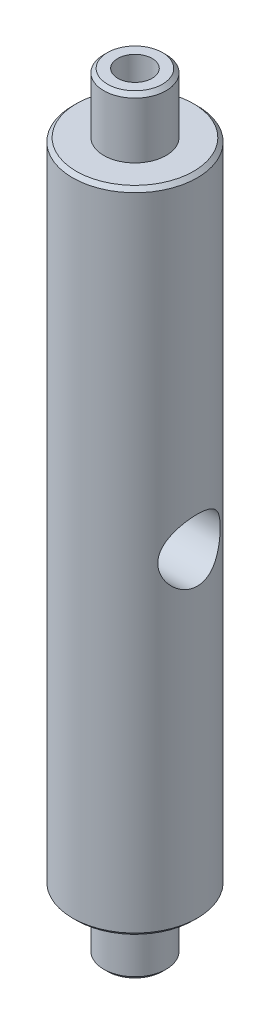
ISO-10303-21;
HEADER;
FILE_DESCRIPTION(('STEP AP214'),'2;1');
FILE_NAME('part.step','',(''),(''),'','','');
FILE_SCHEMA(('AUTOMOTIVE_DESIGN { 1 0 10303 214 1 1 1 1 }'));
ENDSEC;
DATA;
#1=APPLICATION_CONTEXT('core data for automotive mechanical design processes');
#2=APPLICATION_PROTOCOL_DEFINITION('international standard','automotive_design',2000,#1);
#3=PRODUCT_CONTEXT('',#1,'mechanical');
#4=PRODUCT('Part','Part','',(#3));
#5=PRODUCT_RELATED_PRODUCT_CATEGORY('part','',(#4));
#6=PRODUCT_DEFINITION_FORMATION('','',#4);
#7=PRODUCT_DEFINITION_CONTEXT('part definition',#1,'design');
#8=PRODUCT_DEFINITION('design','',#6,#7);
#9=PRODUCT_DEFINITION_SHAPE('','',#8);
#10=(LENGTH_UNIT() NAMED_UNIT(*) SI_UNIT(.MILLI.,.METRE.));
#11=(NAMED_UNIT(*) PLANE_ANGLE_UNIT() SI_UNIT($,.RADIAN.));
#12=(NAMED_UNIT(*) SI_UNIT($,.STERADIAN.) SOLID_ANGLE_UNIT());
#13=UNCERTAINTY_MEASURE_WITH_UNIT(LENGTH_MEASURE(1.E-05),#10,'distance_accuracy_value','');
#14=(GEOMETRIC_REPRESENTATION_CONTEXT(3) GLOBAL_UNCERTAINTY_ASSIGNED_CONTEXT((#13)) GLOBAL_UNIT_ASSIGNED_CONTEXT((#10,
#11,#12)) REPRESENTATION_CONTEXT('',''));
#15=CARTESIAN_POINT('',(0.,0.,0.));
#16=DIRECTION('',(0.,0.,1.));
#17=DIRECTION('',(1.,0.,0.));
#18=AXIS2_PLACEMENT_3D('',#15,#16,#17);
#19=CARTESIAN_POINT('',(0.,66.04,0.));
#20=DIRECTION('',(0.,1.,0.));
#21=DIRECTION('',(0.,0.,1.));
#22=AXIS2_PLACEMENT_3D('',#19,#20,#21);
#23=PLANE('',#22);
#24=CARTESIAN_POINT('',(0.,66.04,0.));
#25=DIRECTION('',(0.,1.,0.));
#26=DIRECTION('',(0.,0.,1.));
#27=AXIS2_PLACEMENT_3D('',#24,#25,#26);
#28=CIRCLE('',#27,5.96899999999999);
#29=CARTESIAN_POINT('',(0.,66.04,5.96899999999999));
#30=VERTEX_POINT('',#29);
#31=EDGE_CURVE('E127',#30,#30,#28,.T.);
#32=ORIENTED_EDGE('',*,*,#31,.T.);
#33=EDGE_LOOP('',(#32));
#34=FACE_BOUND('',#33,.T.);
#35=CARTESIAN_POINT('',(0.,66.04,0.));
#36=DIRECTION('',(0.,1.,0.));
#37=DIRECTION('',(0.,0.,1.));
#38=AXIS2_PLACEMENT_3D('',#35,#36,#37);
#39=CIRCLE('',#38,3.175);
#40=CARTESIAN_POINT('',(0.,66.04,-3.175));
#41=VERTEX_POINT('',#40);
#42=EDGE_CURVE('E115',#41,#41,#39,.T.);
#43=ORIENTED_EDGE('',*,*,#42,.F.);
#44=EDGE_LOOP('',(#43));
#45=FACE_BOUND('',#44,.T.);
#46=ADVANCED_FACE('F31',(#34,#45),#23,.T.);
#47=CARTESIAN_POINT('',(0.,0.,0.));
#48=DIRECTION('',(0.,1.,0.));
#49=DIRECTION('',(0.,0.,1.));
#50=AXIS2_PLACEMENT_3D('',#47,#48,#49);
#51=PLANE('',#50);
#52=CARTESIAN_POINT('',(0.,0.,0.));
#53=DIRECTION('',(0.,1.,0.));
#54=DIRECTION('',(0.,0.,1.));
#55=AXIS2_PLACEMENT_3D('',#52,#53,#54);
#56=CIRCLE('',#55,5.96900000000001);
#57=CARTESIAN_POINT('',(0.,0.,5.96900000000001));
#58=VERTEX_POINT('',#57);
#59=EDGE_CURVE('E109',#58,#58,#56,.F.);
#60=ORIENTED_EDGE('',*,*,#59,.T.);
#61=EDGE_LOOP('',(#60));
#62=FACE_BOUND('',#61,.T.);
#63=CARTESIAN_POINT('',(0.,0.,0.));
#64=DIRECTION('',(0.,1.,0.));
#65=DIRECTION('',(0.,0.,1.));
#66=AXIS2_PLACEMENT_3D('',#63,#64,#65);
#67=CIRCLE('',#66,3.175);
#68=CARTESIAN_POINT('',(0.,0.,3.175));
#69=VERTEX_POINT('',#68);
#70=EDGE_CURVE('E112',#69,#69,#67,.F.);
#71=ORIENTED_EDGE('',*,*,#70,.F.);
#72=EDGE_LOOP('',(#71));
#73=FACE_BOUND('',#72,.T.);
#74=ADVANCED_FACE('F99',(#62,#73),#51,.F.);
#75=CARTESIAN_POINT('',(0.,66.04,0.));
#76=DIRECTION('',(0.,-1.,0.));
#77=DIRECTION('',(0.,0.,-1.));
#78=AXIS2_PLACEMENT_3D('',#75,#76,#77);
#79=CYLINDRICAL_SURFACE('',#78,6.35);
#80=CARTESIAN_POINT('',(-6.35,29.6545,0.));
#81=CARTESIAN_POINT('',(-6.34999931166444,29.6545008877176,-0.0834969220595));
#82=CARTESIAN_POINT('',(-6.34834758911701,29.6577998744459,-0.167002655580043));
#83=CARTESIAN_POINT('',(-6.34179105821715,29.6709458745499,-0.333378330258781));
#84=CARTESIAN_POINT('',(-6.33688483467113,29.6807957365258,-0.416247978955772));
#85=CARTESIAN_POINT('',(-6.31742426748325,29.720072065046,-0.66318203064701));
#86=CARTESIAN_POINT('',(-6.29812827299425,29.7592250774014,-0.825450146761554));
#87=CARTESIAN_POINT('',(-6.2489182313574,29.8614907112941,-1.13965128900426));
#88=CARTESIAN_POINT('',(-6.21904547786825,29.9245102192434,-1.29162180811868));
#89=CARTESIAN_POINT('',(-6.15142812041637,30.0722360736289,-1.58264035037879));
#90=CARTESIAN_POINT('',(-6.11368413715877,30.156940710151,-1.72168939123018));
#91=CARTESIAN_POINT('',(-6.03111096182982,30.3514696297342,-1.99234108848171));
#92=CARTESIAN_POINT('',(-5.98599127270818,30.4625035777939,-2.12298433900091));
#93=CARTESIAN_POINT('',(-5.89470535591056,30.7038966835728,-2.36467069069853));
#94=CARTESIAN_POINT('',(-5.84853836069043,30.8342704297664,-2.47569885601321));
#95=CARTESIAN_POINT('',(-5.75623634934464,31.1229209477533,-2.68368848497886));
#96=CARTESIAN_POINT('',(-5.71038146176788,31.2825775313016,-2.77889135161934));
#97=CARTESIAN_POINT('',(-5.64919759286363,31.5340479871744,-2.90019349951534));
#98=CARTESIAN_POINT('',(-5.63006420805933,31.6199000618287,-2.93705266116891));
#99=CARTESIAN_POINT('',(-5.59504604853268,31.7950856137064,-3.00322508739606));
#100=CARTESIAN_POINT('',(-5.57915935583429,31.8844169981805,-3.03254280972159));
#101=CARTESIAN_POINT('',(-5.55212611635049,32.0605105519647,-3.08174263292982));
#102=CARTESIAN_POINT('',(-5.54075429137746,32.1471107940286,-3.10208128111978));
#103=CARTESIAN_POINT('',(-5.52193654886444,32.3220872789944,-3.13545600360765));
#104=CARTESIAN_POINT('',(-5.51448854851135,32.4104625537717,-3.14849595237257));
#105=CARTESIAN_POINT('',(-5.50383875782919,32.5882067388486,-3.1670771305344));
#106=CARTESIAN_POINT('',(-5.50063441026522,32.6775750179874,-3.17262287599649));
#107=CARTESIAN_POINT('',(-5.49859788398609,32.8564807841781,-3.17614778806993));
#108=CARTESIAN_POINT('',(-5.49976528812799,32.9460182542713,-3.17412767659872));
#109=CARTESIAN_POINT('',(-5.50899190362733,33.1922478757244,-3.1581193033026));
#110=CARTESIAN_POINT('',(-5.52160857357707,33.3483417298134,-3.13621253452965));
#111=CARTESIAN_POINT('',(-5.55866493052824,33.6541466413065,-3.07003746372168));
#112=CARTESIAN_POINT('',(-5.58310838358077,33.8038556490228,-3.02576203854504));
#113=CARTESIAN_POINT('',(-5.64157885407237,34.0970442965641,-2.91531509833647));
#114=CARTESIAN_POINT('',(-5.67581583876129,34.2402976099366,-2.84865758129417));
#115=CARTESIAN_POINT('',(-5.75003268807633,34.514266086174,-2.69570761526054));
#116=CARTESIAN_POINT('',(-5.79001512927804,34.6449755796085,-2.60940634674629));
#117=CARTESIAN_POINT('',(-5.87734289018611,34.9076042742503,-2.40685964249565));
#118=CARTESIAN_POINT('',(-5.92497898403936,35.0375753848565,-2.28820488335253));
#119=CARTESIAN_POINT('',(-6.01813700574905,35.2765851428638,-2.03058898448427));
#120=CARTESIAN_POINT('',(-6.06365791538158,35.3856137863587,-1.89161819563546));
#121=CARTESIAN_POINT('',(-6.1500381059768,35.5844019197197,-1.58913989972483));
#122=CARTESIAN_POINT('',(-6.19058274974572,35.6730314855799,-1.42479265164789));
#123=CARTESIAN_POINT('',(-6.25976272299952,35.8206580816353,-1.08098023585583));
#124=CARTESIAN_POINT('',(-6.28840750578946,35.8796786411317,-0.901527205073899));
#125=CARTESIAN_POINT('',(-6.32854759690357,35.961559403399,-0.548533610626835));
#126=CARTESIAN_POINT('',(-6.34126679122995,35.9870096725873,-0.375734359385246));
#127=CARTESIAN_POINT('',(-6.35231817716325,36.0091505222602,-0.0278752299448329));
#128=CARTESIAN_POINT('',(-6.35065718436129,36.0058547271393,0.147183538060018));
#129=CARTESIAN_POINT('',(-6.33384535408399,35.9720937640546,0.480164686080361));
#130=CARTESIAN_POINT('',(-6.31975005060431,35.9437542085251,0.638363620564188));
#131=CARTESIAN_POINT('',(-6.28085393924121,35.8640441217901,0.947441883052999));
#132=CARTESIAN_POINT('',(-6.25605195113515,35.8126710515227,1.09832040207141));
#133=CARTESIAN_POINT('',(-6.19709998236334,35.6870048690622,1.39347133182512));
#134=CARTESIAN_POINT('',(-6.16270299610718,35.6120984158888,1.53743151047822));
#135=CARTESIAN_POINT('',(-6.08787118465664,35.4421835743141,1.8112148234104));
#136=CARTESIAN_POINT('',(-6.0474337895468,35.3471666226146,1.94103189959927));
#137=CARTESIAN_POINT('',(-5.95973602709939,35.1289606496262,2.19636241342679));
#138=CARTESIAN_POINT('',(-5.91219559251098,35.0039213928884,2.3202013468198));
#139=CARTESIAN_POINT('',(-5.81858093231368,34.7347376448502,2.54589381918873));
#140=CARTESIAN_POINT('',(-5.77250773963547,34.5905800476191,2.6477321493525));
#141=CARTESIAN_POINT('',(-5.68487535288742,34.2784313980416,2.83117262876716));
#142=CARTESIAN_POINT('',(-5.64364281441821,34.1096242304896,2.91155594998014));
#143=CARTESIAN_POINT('',(-5.5744767953732,33.7581555351103,3.04191297152939));
#144=CARTESIAN_POINT('',(-5.54652618900869,33.5755122021526,3.0919258549222));
#145=CARTESIAN_POINT('',(-5.51057765714603,33.2203100435298,3.15551086037918));
#146=CARTESIAN_POINT('',(-5.50092192343245,33.0484662495928,3.17212027309711));
#147=CARTESIAN_POINT('',(-5.49800001145358,32.7042555575048,3.17718805563876));
#148=CARTESIAN_POINT('',(-5.50472672904441,32.5318889184574,3.16565862768386));
#149=CARTESIAN_POINT('',(-5.53205211477784,32.2088398969261,3.11761548073658));
#150=CARTESIAN_POINT('',(-5.55126823076269,32.0576560582688,3.08358651207686));
#151=CARTESIAN_POINT('',(-5.59977978302582,31.7633091698328,2.99458164828807));
#152=CARTESIAN_POINT('',(-5.62907846127335,31.6201487171497,2.93959901505999));
#153=CARTESIAN_POINT('',(-5.69685576337174,31.3352663005715,2.8061154442137));
#154=CARTESIAN_POINT('',(-5.73581889480533,31.1942871906343,2.72628260503929));
#155=CARTESIAN_POINT('',(-5.81772207082382,30.9268025682769,2.54682759156583));
#156=CARTESIAN_POINT('',(-5.8606641782013,30.8003046400573,2.44719512169931));
#157=CARTESIAN_POINT('',(-5.95192753761203,30.5494024758229,2.21680287661219));
#158=CARTESIAN_POINT('',(-6.00026839877346,30.4271202435872,2.08373188558712));
#159=CARTESIAN_POINT('',(-6.0921234557675,30.2061021267669,1.79751265125244));
#160=CARTESIAN_POINT('',(-6.13563504323043,30.1073789340173,1.64435365457428));
#161=CARTESIAN_POINT('',(-6.19391073190243,29.9792197338029,1.40178715704487));
#162=CARTESIAN_POINT('',(-6.21223173271383,29.9396994163186,1.31842200030918));
#163=CARTESIAN_POINT('',(-6.24595363475604,29.8679005251763,1.1480770102167));
#164=CARTESIAN_POINT('',(-6.26135597012704,29.8356183934656,1.06109897786306));
#165=CARTESIAN_POINT('',(-6.28875097111981,29.778740654085,0.884361322813107));
#166=CARTESIAN_POINT('',(-6.30075106809478,29.7541282818619,0.794608244970571));
#167=CARTESIAN_POINT('',(-6.32100983571903,29.7128326104701,0.612925661591581));
#168=CARTESIAN_POINT('',(-6.3292707916836,29.6961444678064,0.52099752168029));
#169=CARTESIAN_POINT('',(-6.34032503263334,29.6738837151376,0.357531347524375));
#170=CARTESIAN_POINT('',(-6.34394670812889,29.6666211787504,0.286274046488597));
#171=CARTESIAN_POINT('',(-6.34878452045567,29.6569288734624,0.143346668941348));
#172=CARTESIAN_POINT('',(-6.35000059089052,29.6544992379532,0.0716765810914262));
#173=CARTESIAN_POINT('',(-6.35,29.6545,0.));
#174=B_SPLINE_CURVE_WITH_KNOTS('',3,(#80,#81,#82,#83,#84,#85,#86,#87,#88,#89,#90,#91,#92,#93,
#94,#95,#96,#97,#98,#99,#100,#101,#102,#103,#104,#105,#106,#107,#108,#109,#110,#111,#112,#113,
#114,#115,#116,#117,#118,#119,#120,#121,#122,#123,#124,#125,#126,#127,#128,#129,#130,#131,#132,
#133,#134,#135,#136,#137,#138,#139,#140,#141,#142,#143,#144,#145,#146,#147,#148,#149,#150,#151,
#152,#153,#154,#155,#156,#157,#158,#159,#160,#161,#162,#163,#164,#165,#166,#167,#168,#169,#170,
#171,#172,#173),.UNSPECIFIED.,.T.,.F.,(4,2,2,2,2,2,2,2,2,2,2,2,2,2,2,2,2,2,2,2,2,2,2,2,2,2,2,2,
2,2,2,2,2,2,2,2,2,2,2,2,2,2,2,2,2,2,4),(0.,0.25041561210268,0.500940186864014,1.00234854488129,
1.50182051324263,2.00125310940106,2.53090025348452,3.06094897410614,3.63210298373098,
3.91787290005988,4.20347350732849,4.47213270490103,4.74064915090148,5.00900371453887,
5.27733267302576,5.74927594687739,6.22136960256845,6.70445970327763,7.18776712794021,
7.7323564652788,8.27720530143645,8.84735553323665,9.41705196489303,9.93956405039338,
10.4618285011675,10.9436138594975,11.4254523397102,11.9210677568139,12.4168946391879,
12.9614122158798,13.5063050164601,14.0775857365549,14.6481278321882,15.1639000911419,
15.6794487286237,16.1458838633213,16.6124691169503,17.1104020806943,17.6085946442304,
18.1673210354482,18.7263477502426,19.0082017078365,19.2899168101042,19.5710117490933,
19.8519346536844,20.0668939492147,20.2818591776892),.UNSPECIFIED.);
#175=CARTESIAN_POINT('',(-6.35,29.6545,0.));
#176=VERTEX_POINT('',#175);
#177=EDGE_CURVE('E10',#176,#176,#174,.T.);
#178=ORIENTED_EDGE('',*,*,#177,.T.);
#179=EDGE_LOOP('',(#178));
#180=FACE_BOUND('',#179,.T.);
#181=CARTESIAN_POINT('',(5.49926131403119,32.8295,-3.175));
#182=CARTESIAN_POINT('',(5.49926232876913,32.7467380864674,-3.17499905676822));
#183=CARTESIAN_POINT('',(5.50113815093942,32.6639660849583,-3.17175738528249));
#184=CARTESIAN_POINT('',(5.50856077670455,32.4990797871413,-3.15884523354688));
#185=CARTESIAN_POINT('',(5.51410928932437,32.4169658150492,-3.1491717603564));
#186=CARTESIAN_POINT('',(5.53601678924102,32.1723342515892,-3.11062065473092));
#187=CARTESIAN_POINT('',(5.55763722742636,32.011671953019,-3.07221261154103));
#188=CARTESIAN_POINT('',(5.61178865498313,31.7009021878542,-2.97211747978078));
#189=CARTESIAN_POINT('',(5.6442615458663,31.5507435598136,-2.9105541372517));
#190=CARTESIAN_POINT('',(5.71635543890045,31.2628885772,-2.76627435445934));
#191=CARTESIAN_POINT('',(5.75597682772092,31.1251928973657,-2.6835567698406));
#192=CARTESIAN_POINT('',(5.84190034267495,30.8536761786603,-2.49131627779834));
#193=CARTESIAN_POINT('',(5.88848395338309,30.7211114027183,-2.38014521787043));
#194=CARTESIAN_POINT('',(5.98081052060146,30.4755292087452,-2.13758083606043));
#195=CARTESIAN_POINT('',(6.02655304768282,30.362521541095,-2.00617748851801));
#196=CARTESIAN_POINT('',(6.11573187346572,30.1518090471499,-1.71605436473863));
#197=CARTESIAN_POINT('',(6.15880487346127,30.0556492210603,-1.55609032527602));
#198=CARTESIAN_POINT('',(6.23413651147239,29.8921778568886,-1.21969855929243));
#199=CARTESIAN_POINT('',(6.26640197156108,29.824848112814,-1.04328130884119));
#200=CARTESIAN_POINT('',(6.31445464313237,29.7259226854614,-0.692292696730399));
#201=CARTESIAN_POINT('',(6.33125099630315,29.6921252532058,-0.518483183758176));
#202=CARTESIAN_POINT('',(6.35024078782237,29.6539725738217,-0.166911747158853));
#203=CARTESIAN_POINT('',(6.35244306187831,29.6495995122434,0.0108477196166808));
#204=CARTESIAN_POINT('',(6.34247467450733,29.6695707012052,0.348718268640214));
#205=CARTESIAN_POINT('',(6.33153724004097,29.6914507432159,0.50901982027069));
#206=CARTESIAN_POINT('',(6.29838229153245,29.7588966354579,0.823321212955331));
#207=CARTESIAN_POINT('',(6.27616393341038,29.8044642580866,0.977320581525266));
#208=CARTESIAN_POINT('',(6.22209775234818,29.9182873140228,1.27733236684466));
#209=CARTESIAN_POINT('',(6.19012095460316,29.9868479205207,1.42320480220676));
#210=CARTESIAN_POINT('',(6.11942032404916,30.1442857200159,1.70172616219331));
#211=CARTESIAN_POINT('',(6.08069407688628,30.2331701866477,1.83437032813194));
#212=CARTESIAN_POINT('',(5.99580926070808,30.438395301586,2.09605211974366));
#213=CARTESIAN_POINT('',(5.94929416927823,30.5565370904291,2.22356359612797));
#214=CARTESIAN_POINT('',(5.85642633307518,30.8120623935202,2.45777846555886));
#215=CARTESIAN_POINT('',(5.81007373990265,30.9494605735396,2.56446584928023));
#216=CARTESIAN_POINT('',(5.71957289604347,31.2504477683689,2.76069102698818));
#217=CARTESIAN_POINT('',(5.67575155752789,31.4151459110587,2.84870951352547));
#218=CARTESIAN_POINT('',(5.61885247415839,31.6733375661308,2.95849503046443));
#219=CARTESIAN_POINT('',(5.60135560040996,31.7612779285117,2.99138760520285));
#220=CARTESIAN_POINT('',(5.56999217748627,31.9402974382114,3.04938956554735));
#221=CARTESIAN_POINT('',(5.55612339050229,32.0313746113191,3.07450375064138));
#222=CARTESIAN_POINT('',(5.53355357587716,32.2086516314038,3.11492823782859));
#223=CARTESIAN_POINT('',(5.52453156228568,32.2946706421334,3.13085491331031));
#224=CARTESIAN_POINT('',(5.51045313491466,32.4680106275881,3.15556797554225));
#225=CARTESIAN_POINT('',(5.50539465890766,32.5553309011336,3.16435807553686));
#226=CARTESIAN_POINT('',(5.49945626530651,32.7305151488662,3.17466835867007));
#227=CARTESIAN_POINT('',(5.49857479177741,32.8183789083904,3.17619124884848));
#228=CARTESIAN_POINT('',(5.50101508803298,32.9938448376426,3.17195985852084));
#229=CARTESIAN_POINT('',(5.50433657410105,33.0814470246276,3.16620606921981));
#230=CARTESIAN_POINT('',(5.51925588435845,33.3235925856452,3.14018226453034));
#231=CARTESIAN_POINT('',(5.53528611699027,33.4771056075286,3.11209439281024));
#232=CARTESIAN_POINT('',(5.57828096923593,33.7768468805933,3.03433762958359));
#233=CARTESIAN_POINT('',(5.6052491297211,33.9230727555203,2.98466174914483));
#234=CARTESIAN_POINT('',(5.66852625788959,34.2119226266486,2.86273054239685));
#235=CARTESIAN_POINT('',(5.7052099977014,34.3540661320318,2.78953600385261));
#236=CARTESIAN_POINT('',(5.7834564691364,34.6248671847707,2.62346157669833));
#237=CARTESIAN_POINT('',(5.82502170218951,34.7535177534421,2.53057157570877));
#238=CARTESIAN_POINT('',(5.91464405440152,35.0106568715187,2.31405795861387));
#239=CARTESIAN_POINT('',(5.96285904289681,35.1370807617025,2.18803622695198));
#240=CARTESIAN_POINT('',(6.0558119327906,35.3676340475204,1.91580928554186));
#241=CARTESIAN_POINT('',(6.10054865642871,35.4717559123232,1.76959728537411));
#242=CARTESIAN_POINT('',(6.18303824145362,35.6570715266821,1.45584977269243));
#243=CARTESIAN_POINT('',(6.22057562531784,35.7375876368263,1.28785333421913));
#244=CARTESIAN_POINT('',(6.28279651772886,35.8684128582287,0.938283508313609));
#245=CARTESIAN_POINT('',(6.30749131056505,35.9187484938744,0.756722200806243));
#246=CARTESIAN_POINT('',(6.33944338582815,35.9834451905403,0.403160492410784));
#247=CARTESIAN_POINT('',(6.34809271326659,36.0006832643018,0.231811338563331));
#248=CARTESIAN_POINT('',(6.35133763722966,36.0071773594255,-0.111525009731685));
#249=CARTESIAN_POINT('',(6.3459381534549,35.9964431762855,-0.283511959769313));
#250=CARTESIAN_POINT('',(6.32250351776756,35.949202940442,-0.611308110350749));
#251=CARTESIAN_POINT('',(6.30532443151586,35.9144417201372,-0.767436553820506));
#252=CARTESIAN_POINT('',(6.26084894800281,35.8224866606661,-1.07139095342116));
#253=CARTESIAN_POINT('',(6.23355109988091,35.7652896045092,-1.21921571544173));
#254=CARTESIAN_POINT('',(6.16984840144776,35.6275420621377,-1.50946910032132));
#255=CARTESIAN_POINT('',(6.13310397734646,35.5460973718741,-1.65139651176319));
#256=CARTESIAN_POINT('',(6.05434784579293,35.3632818456706,-1.92016030444462));
#257=CARTESIAN_POINT('',(6.0123337223239,35.2619018577453,-2.04698971133066));
#258=CARTESIAN_POINT('',(5.92228494250573,35.0304261687049,-2.29524860659569));
#259=CARTESIAN_POINT('',(5.87406724075614,34.8984767688479,-2.41488454123001));
#260=CARTESIAN_POINT('',(5.78049654064408,34.6155662694591,-2.63101905620371));
#261=CARTESIAN_POINT('',(5.73514610261339,34.4645885287421,-2.7274971667743));
#262=CARTESIAN_POINT('',(5.67271720109896,34.2238205187556,-2.85396050304135));
#263=CARTESIAN_POINT('',(5.65257123598791,34.1397422772936,-2.89354057606826));
#264=CARTESIAN_POINT('',(5.61522862075768,33.9678927754824,-2.96535747654718));
#265=CARTESIAN_POINT('',(5.59803045260694,33.8801234451167,-2.99759808643801));
#266=CARTESIAN_POINT('',(5.5673118679383,33.7017309915753,-3.05427194354531));
#267=CARTESIAN_POINT('',(5.55378200380455,33.6111158831695,-3.07872527562276));
#268=CARTESIAN_POINT('',(5.53094387019911,33.4276115214591,-3.11956903021308));
#269=CARTESIAN_POINT('',(5.52163264949546,33.3347239060257,-3.13596509002515));
#270=CARTESIAN_POINT('',(5.50956192150408,33.173036251204,-3.15710761797221));
#271=CARTESIAN_POINT('',(5.5057086840578,33.1045663272401,-3.16381073091702));
#272=CARTESIAN_POINT('',(5.50055787263126,32.967233281387,-3.17275746355016));
#273=CARTESIAN_POINT('',(5.49926046961937,32.8983701335028,-3.17500078490812));
#274=CARTESIAN_POINT('',(5.49926131403119,32.8295,-3.175));
#275=B_SPLINE_CURVE_WITH_KNOTS('',3,(#181,#182,#183,#184,#185,#186,#187,#188,#189,#190,#191,
#192,#193,#194,#195,#196,#197,#198,#199,#200,#201,#202,#203,#204,#205,#206,#207,#208,#209,#210,
#211,#212,#213,#214,#215,#216,#217,#218,#219,#220,#221,#222,#223,#224,#225,#226,#227,#228,#229,
#230,#231,#232,#233,#234,#235,#236,#237,#238,#239,#240,#241,#242,#243,#244,#245,#246,#247,#248,
#249,#250,#251,#252,#253,#254,#255,#256,#257,#258,#259,#260,#261,#262,#263,#264,#265,#266,#267,
#268,#269,#270,#271,#272,#273,#274),.UNSPECIFIED.,.T.,.F.,(4,2,2,2,2,2,2,2,2,2,2,2,2,2,2,2,2,2,
2,2,2,2,2,2,2,2,2,2,2,2,2,2,2,2,2,2,2,2,2,2,2,2,2,2,2,2,4),(0.,0.248210314193366,
0.496536210172844,0.993616655653379,1.48807751301481,1.98256512428753,2.51783706318108,
3.05337510292796,3.62501229957992,4.19628797710272,4.72691486873112,5.25722047303095,
5.74141031613327,6.22563639342838,6.71656194871308,7.20766347537031,7.74518754975545,
8.28312325280709,8.85521994590917,9.14138502893469,9.42737318655796,9.69083660833535,
9.95416285897606,10.2173910127766,10.4806013985705,10.9489167635524,11.4173838546846,
11.9075481007329,12.3979646273261,12.9502005485241,13.5026226528975,14.0696241997013,
14.6361266987681,15.1506510247058,15.6649951955482,16.1454469295095,16.625967578846,
17.1270402751829,17.6283435455375,18.1795366185793,18.7312151251733,19.0161455987001,
19.3009288973909,19.5849716229022,19.8688153329579,20.075349152287,20.2818967868888),.UNSPECIFIED.);
#276=CARTESIAN_POINT('',(5.49926131403119,32.8295,-3.175));
#277=VERTEX_POINT('',#276);
#278=EDGE_CURVE('E42',#277,#277,#275,.T.);
#279=ORIENTED_EDGE('',*,*,#278,.T.);
#280=EDGE_LOOP('',(#279));
#281=FACE_BOUND('',#280,.T.);
#282=CARTESIAN_POINT('',(0.,65.659,0.));
#283=DIRECTION('',(0.,1.,0.));
#284=DIRECTION('',(0.,0.,1.));
#285=AXIS2_PLACEMENT_3D('',#282,#283,#284);
#286=CIRCLE('',#285,6.35);
#287=CARTESIAN_POINT('',(0.,65.659,6.35));
#288=VERTEX_POINT('',#287);
#289=EDGE_CURVE('E133',#288,#288,#286,.F.);
#290=ORIENTED_EDGE('',*,*,#289,.T.);
#291=EDGE_LOOP('',(#290));
#292=FACE_BOUND('',#291,.T.);
#293=CARTESIAN_POINT('',(0.,0.380999999999992,0.));
#294=DIRECTION('',(0.,1.,0.));
#295=DIRECTION('',(0.,0.,1.));
#296=AXIS2_PLACEMENT_3D('',#293,#294,#295);
#297=CIRCLE('',#296,6.35);
#298=CARTESIAN_POINT('',(0.,0.380999999999992,6.35));
#299=VERTEX_POINT('',#298);
#300=EDGE_CURVE('E130',#299,#299,#297,.T.);
#301=ORIENTED_EDGE('',*,*,#300,.T.);
#302=EDGE_LOOP('',(#301));
#303=FACE_BOUND('',#302,.T.);
#304=ADVANCED_FACE('F55',(#180,#281,#292,#303),#79,.T.);
#305=CARTESIAN_POINT('',(0.,-6.096,0.));
#306=DIRECTION('',(0.,1.,0.));
#307=DIRECTION('',(0.,0.,1.));
#308=AXIS2_PLACEMENT_3D('',#305,#306,#307);
#309=CYLINDRICAL_SURFACE('',#308,3.175);
#310=CARTESIAN_POINT('',(0.,-5.71500000000001,0.));
#311=DIRECTION('',(0.,-1.,0.));
#312=DIRECTION('',(0.,0.,-1.));
#313=AXIS2_PLACEMENT_3D('',#310,#311,#312);
#314=CIRCLE('',#313,3.175);
#315=CARTESIAN_POINT('',(0.,-5.71500000000001,3.175));
#316=VERTEX_POINT('',#315);
#317=EDGE_CURVE('E46',#316,#316,#314,.F.);
#318=CARTESIAN_POINT('',(0.,-5.71500000000001,3.175));
#319=CARTESIAN_POINT('',(0.,-5.65546875000001,3.175));
#320=CARTESIAN_POINT('',(0.,-5.59593750000001,3.175));
#321=CARTESIAN_POINT('',(0.,-5.47687500000001,3.175));
#322=CARTESIAN_POINT('',(0.,-5.41734375000001,3.175));
#323=CARTESIAN_POINT('',(0.,-5.29828125000001,3.175));
#324=CARTESIAN_POINT('',(0.,-5.23875000000001,3.175));
#325=CARTESIAN_POINT('',(0.,-5.11968750000001,3.175));
#326=CARTESIAN_POINT('',(0.,-5.06015625000001,3.175));
#327=CARTESIAN_POINT('',(0.,-4.94109375000001,3.175));
#328=CARTESIAN_POINT('',(0.,-4.88156250000001,3.175));
#329=CARTESIAN_POINT('',(0.,-4.76250000000001,3.175));
#330=CARTESIAN_POINT('',(0.,-4.70296875000001,3.175));
#331=CARTESIAN_POINT('',(0.,-4.58390625000001,3.175));
#332=CARTESIAN_POINT('',(0.,-4.52437500000001,3.175));
#333=CARTESIAN_POINT('',(0.,-4.40531250000001,3.175));
#334=CARTESIAN_POINT('',(0.,-4.34578125000001,3.175));
#335=CARTESIAN_POINT('',(0.,-4.22671875000001,3.175));
#336=CARTESIAN_POINT('',(0.,-4.16718750000001,3.175));
#337=CARTESIAN_POINT('',(0.,-4.04812500000001,3.175));
#338=CARTESIAN_POINT('',(0.,-3.98859375000001,3.175));
#339=CARTESIAN_POINT('',(0.,-3.86953125000001,3.175));
#340=CARTESIAN_POINT('',(0.,-3.81,3.175));
#341=CARTESIAN_POINT('',(0.,-3.6909375,3.175));
#342=CARTESIAN_POINT('',(0.,-3.63140625,3.175));
#343=CARTESIAN_POINT('',(0.,-3.51234375,3.175));
#344=CARTESIAN_POINT('',(0.,-3.4528125,3.175));
#345=CARTESIAN_POINT('',(0.,-3.33375,3.175));
#346=CARTESIAN_POINT('',(0.,-3.27421875,3.175));
#347=CARTESIAN_POINT('',(0.,-3.15515625,3.175));
#348=CARTESIAN_POINT('',(0.,-3.095625,3.175));
#349=CARTESIAN_POINT('',(0.,-2.9765625,3.175));
#350=CARTESIAN_POINT('',(0.,-2.91703125,3.175));
#351=CARTESIAN_POINT('',(0.,-2.79796875,3.175));
#352=CARTESIAN_POINT('',(0.,-2.7384375,3.175));
#353=CARTESIAN_POINT('',(0.,-2.619375,3.175));
#354=CARTESIAN_POINT('',(0.,-2.55984375,3.175));
#355=CARTESIAN_POINT('',(0.,-2.44078125,3.175));
#356=CARTESIAN_POINT('',(0.,-2.38125,3.175));
#357=CARTESIAN_POINT('',(0.,-2.2621875,3.175));
#358=CARTESIAN_POINT('',(0.,-2.20265625,3.175));
#359=CARTESIAN_POINT('',(0.,-2.08359375,3.175));
#360=CARTESIAN_POINT('',(0.,-2.0240625,3.175));
#361=CARTESIAN_POINT('',(0.,-1.905,3.175));
#362=CARTESIAN_POINT('',(0.,-1.84546875,3.175));
#363=CARTESIAN_POINT('',(0.,-1.72640625,3.175));
#364=CARTESIAN_POINT('',(0.,-1.666875,3.175));
#365=CARTESIAN_POINT('',(0.,-1.5478125,3.175));
#366=CARTESIAN_POINT('',(0.,-1.48828125,3.175));
#367=CARTESIAN_POINT('',(0.,-1.36921875,3.175));
#368=CARTESIAN_POINT('',(0.,-1.3096875,3.175));
#369=CARTESIAN_POINT('',(0.,-1.190625,3.175));
#370=CARTESIAN_POINT('',(0.,-1.13109375,3.175));
#371=CARTESIAN_POINT('',(0.,-1.01203125,3.175));
#372=CARTESIAN_POINT('',(0.,-0.952500000000001,3.175));
#373=CARTESIAN_POINT('',(0.,-0.833437500000001,3.175));
#374=CARTESIAN_POINT('',(0.,-0.773906250000001,3.175));
#375=CARTESIAN_POINT('',(0.,-0.654843750000001,3.175));
#376=CARTESIAN_POINT('',(0.,-0.595312500000001,3.175));
#377=CARTESIAN_POINT('',(0.,-0.47625,3.175));
#378=CARTESIAN_POINT('',(0.,-0.41671875,3.175));
#379=CARTESIAN_POINT('',(0.,-0.29765625,3.175));
#380=CARTESIAN_POINT('',(0.,-0.238124999999999,3.175));
#381=CARTESIAN_POINT('',(0.,-0.119062499999999,3.175));
#382=CARTESIAN_POINT('',(0.,-0.0595312499999997,3.175));
#383=CARTESIAN_POINT('',(0.,0.,3.175));
#384=B_SPLINE_CURVE_WITH_KNOTS('',3,(#318,#319,#320,#321,#322,#323,#324,#325,#326,#327,#328,
#329,#330,#331,#332,#333,#334,#335,#336,#337,#338,#339,#340,#341,#342,#343,#344,#345,#346,#347,
#348,#349,#350,#351,#352,#353,#354,#355,#356,#357,#358,#359,#360,#361,#362,#363,#364,#365,#366,
#367,#368,#369,#370,#371,#372,#373,#374,#375,#376,#377,#378,#379,#380,#381,#382,#383),
.UNSPECIFIED.,.F.,.F.,(4,2,2,2,2,2,2,2,2,2,2,2,2,2,2,2,2,2,2,2,2,2,2,2,2,2,2,2,2,2,2,2,4),(0.,
0.178593750000001,0.357187500000001,0.535781250000002,0.714375000000001,0.892968750000001,
1.0715625,1.25015625,1.42875,1.60734375,1.7859375,1.96453125,2.143125,2.32171875,2.5003125,
2.67890625,2.8575,3.03609375,3.21468750000001,3.39328125,3.571875,3.75046875000001,3.9290625,
4.10765625000001,4.28625000000001,4.46484375000001,4.64343750000001,4.82203125000001,
5.00062500000001,5.17921875000001,5.35781250000001,5.53640625000001,5.71500000000001),.UNSPECIFIED.);
#385=EDGE_CURVE('BSEAM93',#316,#69,#384,.T.);
#386=ORIENTED_EDGE('',*,*,#317,.T.);
#387=ORIENTED_EDGE('',*,*,#70,.T.);
#388=ORIENTED_EDGE('',*,*,#385,.T.);
#389=ORIENTED_EDGE('',*,*,#385,.F.);
#390=EDGE_LOOP('',(#386,#388,#387,#389));
#391=FACE_BOUND('',#390,.T.);
#392=ADVANCED_FACE('F93',(#391),#309,.T.);
#393=CARTESIAN_POINT('',(0.,-6.096,0.));
#394=DIRECTION('',(0.,-1.,0.));
#395=DIRECTION('',(0.,0.,-1.));
#396=AXIS2_PLACEMENT_3D('',#393,#394,#395);
#397=PLANE('',#396);
#398=CARTESIAN_POINT('',(0.,-6.096,0.));
#399=DIRECTION('',(0.,-1.,0.));
#400=DIRECTION('',(0.,0.,-1.));
#401=AXIS2_PLACEMENT_3D('',#398,#399,#400);
#402=CIRCLE('',#401,2.79400000000001);
#403=CARTESIAN_POINT('',(0.,-6.096,-2.79400000000001));
#404=VERTEX_POINT('',#403);
#405=EDGE_CURVE('E50',#404,#404,#402,.T.);
#406=ORIENTED_EDGE('',*,*,#405,.T.);
#407=EDGE_LOOP('',(#406));
#408=FACE_BOUND('',#407,.T.);
#409=CARTESIAN_POINT('',(0.,-6.096,0.));
#410=DIRECTION('',(0.,-1.,0.));
#411=DIRECTION('',(0.,0.,-1.));
#412=AXIS2_PLACEMENT_3D('',#409,#410,#411);
#413=CIRCLE('',#412,1.7526);
#414=CARTESIAN_POINT('',(0.,-6.096,-1.7526));
#415=VERTEX_POINT('',#414);
#416=EDGE_CURVE('E171',#415,#415,#413,.T.);
#417=ORIENTED_EDGE('',*,*,#416,.F.);
#418=EDGE_LOOP('',(#417));
#419=FACE_BOUND('',#418,.T.);
#420=ADVANCED_FACE('F89',(#408,#419),#397,.T.);
#421=CARTESIAN_POINT('',(0.,72.136,0.));
#422=DIRECTION('',(0.,-1.,0.));
#423=DIRECTION('',(0.,0.,-1.));
#424=AXIS2_PLACEMENT_3D('',#421,#422,#423);
#425=CYLINDRICAL_SURFACE('',#424,3.175);
#426=CARTESIAN_POINT('',(0.,71.755,0.));
#427=DIRECTION('',(0.,1.,0.));
#428=DIRECTION('',(0.,0.,1.));
#429=AXIS2_PLACEMENT_3D('',#426,#427,#428);
#430=CIRCLE('',#429,3.175);
#431=CARTESIAN_POINT('',(0.,71.755,-3.175));
#432=VERTEX_POINT('',#431);
#433=EDGE_CURVE('E118',#432,#432,#430,.F.);
#434=CARTESIAN_POINT('',(0.,71.755,-3.175));
#435=CARTESIAN_POINT('',(0.,71.69546875,-3.175));
#436=CARTESIAN_POINT('',(0.,71.6359375,-3.175));
#437=CARTESIAN_POINT('',(0.,71.516875,-3.175));
#438=CARTESIAN_POINT('',(0.,71.45734375,-3.175));
#439=CARTESIAN_POINT('',(0.,71.33828125,-3.175));
#440=CARTESIAN_POINT('',(0.,71.27875,-3.175));
#441=CARTESIAN_POINT('',(0.,71.1596875,-3.175));
#442=CARTESIAN_POINT('',(0.,71.10015625,-3.175));
#443=CARTESIAN_POINT('',(0.,70.98109375,-3.175));
#444=CARTESIAN_POINT('',(0.,70.9215625,-3.175));
#445=CARTESIAN_POINT('',(0.,70.8025,-3.175));
#446=CARTESIAN_POINT('',(0.,70.74296875,-3.175));
#447=CARTESIAN_POINT('',(0.,70.62390625,-3.175));
#448=CARTESIAN_POINT('',(0.,70.564375,-3.175));
#449=CARTESIAN_POINT('',(0.,70.4453125,-3.175));
#450=CARTESIAN_POINT('',(0.,70.38578125,-3.175));
#451=CARTESIAN_POINT('',(0.,70.26671875,-3.175));
#452=CARTESIAN_POINT('',(0.,70.2071875,-3.175));
#453=CARTESIAN_POINT('',(0.,70.088125,-3.175));
#454=CARTESIAN_POINT('',(0.,70.02859375,-3.175));
#455=CARTESIAN_POINT('',(0.,69.90953125,-3.175));
#456=CARTESIAN_POINT('',(0.,69.85,-3.175));
#457=CARTESIAN_POINT('',(0.,69.7309375,-3.175));
#458=CARTESIAN_POINT('',(0.,69.67140625,-3.175));
#459=CARTESIAN_POINT('',(0.,69.55234375,-3.175));
#460=CARTESIAN_POINT('',(0.,69.4928125,-3.175));
#461=CARTESIAN_POINT('',(0.,69.37375,-3.175));
#462=CARTESIAN_POINT('',(0.,69.31421875,-3.175));
#463=CARTESIAN_POINT('',(0.,69.19515625,-3.175));
#464=CARTESIAN_POINT('',(0.,69.135625,-3.175));
#465=CARTESIAN_POINT('',(0.,69.0165625,-3.175));
#466=CARTESIAN_POINT('',(0.,68.95703125,-3.175));
#467=CARTESIAN_POINT('',(0.,68.83796875,-3.175));
#468=CARTESIAN_POINT('',(0.,68.7784375,-3.175));
#469=CARTESIAN_POINT('',(0.,68.659375,-3.175));
#470=CARTESIAN_POINT('',(0.,68.59984375,-3.175));
#471=CARTESIAN_POINT('',(0.,68.48078125,-3.175));
#472=CARTESIAN_POINT('',(0.,68.42125,-3.175));
#473=CARTESIAN_POINT('',(0.,68.3021875,-3.175));
#474=CARTESIAN_POINT('',(0.,68.24265625,-3.175));
#475=CARTESIAN_POINT('',(0.,68.12359375,-3.175));
#476=CARTESIAN_POINT('',(0.,68.0640625,-3.175));
#477=CARTESIAN_POINT('',(0.,67.945,-3.175));
#478=CARTESIAN_POINT('',(0.,67.88546875,-3.175));
#479=CARTESIAN_POINT('',(0.,67.76640625,-3.175));
#480=CARTESIAN_POINT('',(0.,67.706875,-3.175));
#481=CARTESIAN_POINT('',(0.,67.5878125,-3.175));
#482=CARTESIAN_POINT('',(0.,67.52828125,-3.175));
#483=CARTESIAN_POINT('',(0.,67.40921875,-3.175));
#484=CARTESIAN_POINT('',(0.,67.3496875,-3.175));
#485=CARTESIAN_POINT('',(0.,67.230625,-3.175));
#486=CARTESIAN_POINT('',(0.,67.17109375,-3.175));
#487=CARTESIAN_POINT('',(0.,67.05203125,-3.175));
#488=CARTESIAN_POINT('',(0.,66.9925,-3.175));
#489=CARTESIAN_POINT('',(0.,66.8734375,-3.175));
#490=CARTESIAN_POINT('',(0.,66.81390625,-3.175));
#491=CARTESIAN_POINT('',(0.,66.69484375,-3.175));
#492=CARTESIAN_POINT('',(0.,66.6353125,-3.175));
#493=CARTESIAN_POINT('',(0.,66.51625,-3.175));
#494=CARTESIAN_POINT('',(0.,66.45671875,-3.175));
#495=CARTESIAN_POINT('',(0.,66.33765625,-3.175));
#496=CARTESIAN_POINT('',(0.,66.278125,-3.175));
#497=CARTESIAN_POINT('',(0.,66.1590625,-3.175));
#498=CARTESIAN_POINT('',(0.,66.09953125,-3.175));
#499=CARTESIAN_POINT('',(0.,66.04,-3.175));
#500=B_SPLINE_CURVE_WITH_KNOTS('',3,(#434,#435,#436,#437,#438,#439,#440,#441,#442,#443,#444,
#445,#446,#447,#448,#449,#450,#451,#452,#453,#454,#455,#456,#457,#458,#459,#460,#461,#462,#463,
#464,#465,#466,#467,#468,#469,#470,#471,#472,#473,#474,#475,#476,#477,#478,#479,#480,#481,#482,
#483,#484,#485,#486,#487,#488,#489,#490,#491,#492,#493,#494,#495,#496,#497,#498,#499),
.UNSPECIFIED.,.F.,.F.,(4,2,2,2,2,2,2,2,2,2,2,2,2,2,2,2,2,2,2,2,2,2,2,2,2,2,2,2,2,2,2,2,4),(0.,
0.178593750000011,0.357187500000009,0.535781250000006,0.714375000000003,0.892968750000014,
1.07156250000001,1.25015625000001,1.42875000000001,1.60734375000002,1.78593750000001,
1.96453125000001,2.14312500000001,2.32171875000002,2.50031250000002,2.67890625000002,
2.85750000000001,3.03609375000002,3.21468750000002,3.39328125000002,3.57187500000002,
3.75046875000003,3.92906250000002,4.10765625000002,4.28625000000002,4.46484375000003,
4.64343750000003,4.82203125000003,5.00062500000002,5.17921875000003,5.35781250000003,
5.53640625000003,5.71500000000003),.UNSPECIFIED.);
#501=EDGE_CURVE('BSEAM85',#432,#41,#500,.T.);
#502=ORIENTED_EDGE('',*,*,#433,.T.);
#503=ORIENTED_EDGE('',*,*,#42,.T.);
#504=ORIENTED_EDGE('',*,*,#501,.T.);
#505=ORIENTED_EDGE('',*,*,#501,.F.);
#506=EDGE_LOOP('',(#502,#504,#503,#505));
#507=FACE_BOUND('',#506,.T.);
#508=ADVANCED_FACE('F85',(#507),#425,.T.);
#509=CARTESIAN_POINT('',(0.,72.136,0.));
#510=DIRECTION('',(0.,1.,0.));
#511=DIRECTION('',(0.,0.,1.));
#512=AXIS2_PLACEMENT_3D('',#509,#510,#511);
#513=PLANE('',#512);
#514=CARTESIAN_POINT('',(0.,72.136,0.));
#515=DIRECTION('',(0.,1.,0.));
#516=DIRECTION('',(0.,0.,1.));
#517=AXIS2_PLACEMENT_3D('',#514,#515,#516);
#518=CIRCLE('',#517,2.79400000000002);
#519=CARTESIAN_POINT('',(0.,72.136,2.79400000000002));
#520=VERTEX_POINT('',#519);
#521=EDGE_CURVE('E114',#520,#520,#518,.T.);
#522=ORIENTED_EDGE('',*,*,#521,.T.);
#523=EDGE_LOOP('',(#522));
#524=FACE_BOUND('',#523,.T.);
#525=CARTESIAN_POINT('',(0.,72.136,0.));
#526=DIRECTION('',(0.,1.,0.));
#527=DIRECTION('',(0.,0.,1.));
#528=AXIS2_PLACEMENT_3D('',#525,#526,#527);
#529=CIRCLE('',#528,1.7526);
#530=CARTESIAN_POINT('',(0.,72.136,1.7526));
#531=VERTEX_POINT('',#530);
#532=EDGE_CURVE('E165',#531,#531,#529,.T.);
#533=ORIENTED_EDGE('',*,*,#532,.F.);
#534=EDGE_LOOP('',(#533));
#535=FACE_BOUND('',#534,.T.);
#536=ADVANCED_FACE('F81',(#524,#535),#513,.T.);
#537=CARTESIAN_POINT('',(0.,60.96,0.));
#538=DIRECTION('',(0.,1.,0.));
#539=DIRECTION('',(0.,0.,1.));
#540=AXIS2_PLACEMENT_3D('',#537,#538,#539);
#541=CYLINDRICAL_SURFACE('',#540,1.7526);
#542=CARTESIAN_POINT('',(0.,60.96,0.));
#543=DIRECTION('',(0.,1.,0.));
#544=DIRECTION('',(0.,0.,1.));
#545=AXIS2_PLACEMENT_3D('',#542,#543,#544);
#546=CIRCLE('',#545,1.7526);
#547=CARTESIAN_POINT('',(0.,60.96,1.7526));
#548=VERTEX_POINT('',#547);
#549=EDGE_CURVE('E121',#548,#548,#546,.T.);
#550=ORIENTED_EDGE('',*,*,#549,.F.);
#551=EDGE_LOOP('',(#550));
#552=FACE_BOUND('',#551,.T.);
#553=ORIENTED_EDGE('',*,*,#532,.T.);
#554=EDGE_LOOP('',(#553));
#555=FACE_BOUND('',#554,.T.);
#556=ADVANCED_FACE('F77',(#552,#555),#541,.F.);
#557=CARTESIAN_POINT('',(0.,60.96,0.));
#558=DIRECTION('',(0.,1.,0.));
#559=DIRECTION('',(0.,0.,1.));
#560=AXIS2_PLACEMENT_3D('',#557,#558,#559);
#561=PLANE('',#560);
#562=ORIENTED_EDGE('',*,*,#549,.T.);
#563=EDGE_LOOP('',(#562));
#564=FACE_BOUND('',#563,.T.);
#565=ADVANCED_FACE('F73',(#564),#561,.T.);
#566=CARTESIAN_POINT('',(0.,5.08,0.));
#567=DIRECTION('',(0.,-1.,0.));
#568=DIRECTION('',(0.,0.,-1.));
#569=AXIS2_PLACEMENT_3D('',#566,#567,#568);
#570=CYLINDRICAL_SURFACE('',#569,1.7526);
#571=CARTESIAN_POINT('',(0.,5.08,0.));
#572=DIRECTION('',(0.,-1.,0.));
#573=DIRECTION('',(0.,0.,-1.));
#574=AXIS2_PLACEMENT_3D('',#571,#572,#573);
#575=CIRCLE('',#574,1.7526);
#576=CARTESIAN_POINT('',(0.,5.08,-1.7526));
#577=VERTEX_POINT('',#576);
#578=EDGE_CURVE('E167',#577,#577,#575,.T.);
#579=ORIENTED_EDGE('',*,*,#578,.F.);
#580=EDGE_LOOP('',(#579));
#581=FACE_BOUND('',#580,.T.);
#582=ORIENTED_EDGE('',*,*,#416,.T.);
#583=EDGE_LOOP('',(#582));
#584=FACE_BOUND('',#583,.T.);
#585=ADVANCED_FACE('F69',(#581,#584),#570,.F.);
#586=CARTESIAN_POINT('',(0.,5.08,0.));
#587=DIRECTION('',(0.,-1.,0.));
#588=DIRECTION('',(0.,0.,-1.));
#589=AXIS2_PLACEMENT_3D('',#586,#587,#588);
#590=PLANE('',#589);
#591=ORIENTED_EDGE('',*,*,#578,.T.);
#592=EDGE_LOOP('',(#591));
#593=FACE_BOUND('',#592,.T.);
#594=ADVANCED_FACE('F64',(#593),#590,.T.);
#595=CARTESIAN_POINT('',(0.,72.136,0.));
#596=DIRECTION('',(0.,-1.,0.));
#597=DIRECTION('',(0.,0.,-1.));
#598=AXIS2_PLACEMENT_3D('',#595,#596,#597);
#599=CONICAL_SURFACE('',#598,2.79400000000002,0.785398163397452);
#600=ORIENTED_EDGE('',*,*,#433,.F.);
#601=EDGE_LOOP('',(#600));
#602=FACE_BOUND('',#601,.T.);
#603=ORIENTED_EDGE('',*,*,#521,.F.);
#604=EDGE_LOOP('',(#603));
#605=FACE_BOUND('',#604,.T.);
#606=ADVANCED_FACE('F68',(#602,#605),#599,.T.);
#607=CARTESIAN_POINT('',(0.,66.04,0.));
#608=DIRECTION('',(0.,-1.,0.));
#609=DIRECTION('',(0.,0.,-1.));
#610=AXIS2_PLACEMENT_3D('',#607,#608,#609);
#611=CONICAL_SURFACE('',#610,5.96899999999999,0.785398163397437);
#612=ORIENTED_EDGE('',*,*,#289,.F.);
#613=EDGE_LOOP('',(#612));
#614=FACE_BOUND('',#613,.T.);
#615=ORIENTED_EDGE('',*,*,#31,.F.);
#616=EDGE_LOOP('',(#615));
#617=FACE_BOUND('',#616,.T.);
#618=ADVANCED_FACE('F146',(#614,#617),#611,.T.);
#619=CARTESIAN_POINT('',(0.,0.380999999999992,0.));
#620=DIRECTION('',(0.,1.,0.));
#621=DIRECTION('',(0.,0.,1.));
#622=AXIS2_PLACEMENT_3D('',#619,#620,#621);
#623=CONICAL_SURFACE('',#622,6.35,0.785398163397445);
#624=ORIENTED_EDGE('',*,*,#59,.F.);
#625=EDGE_LOOP('',(#624));
#626=FACE_BOUND('',#625,.T.);
#627=ORIENTED_EDGE('',*,*,#300,.F.);
#628=EDGE_LOOP('',(#627));
#629=FACE_BOUND('',#628,.T.);
#630=ADVANCED_FACE('F141',(#626,#629),#623,.T.);
#631=CARTESIAN_POINT('',(0.,-6.096,0.));
#632=DIRECTION('',(0.,1.,0.));
#633=DIRECTION('',(0.,0.,1.));
#634=AXIS2_PLACEMENT_3D('',#631,#632,#633);
#635=CONICAL_SURFACE('',#634,2.79400000000001,0.785398163397443);
#636=ORIENTED_EDGE('',*,*,#317,.F.);
#637=EDGE_LOOP('',(#636));
#638=FACE_BOUND('',#637,.T.);
#639=ORIENTED_EDGE('',*,*,#405,.F.);
#640=EDGE_LOOP('',(#639));
#641=FACE_BOUND('',#640,.T.);
#642=ADVANCED_FACE('F33',(#638,#641),#635,.T.);
#643=CARTESIAN_POINT('',(-6.35,32.8295,0.));
#644=DIRECTION('',(1.,0.,0.));
#645=DIRECTION('',(0.,0.,-1.));
#646=AXIS2_PLACEMENT_3D('',#643,#644,#645);
#647=CYLINDRICAL_SURFACE('',#646,3.175);
#648=ORIENTED_EDGE('',*,*,#278,.F.);
#649=EDGE_LOOP('',(#648));
#650=FACE_BOUND('',#649,.T.);
#651=ORIENTED_EDGE('',*,*,#177,.F.);
#652=EDGE_LOOP('',(#651));
#653=FACE_BOUND('',#652,.T.);
#654=ADVANCED_FACE('F59',(#650,#653),#647,.F.);
#655=CLOSED_SHELL('',(#46,#74,#304,#392,#420,#508,#536,#556,#565,#585,#594,#606,#618,#630,#642,#654));
#656=MANIFOLD_SOLID_BREP('B2',#655);
#657=ADVANCED_BREP_SHAPE_REPRESENTATION('',(#18,#656),#14);
#658=SHAPE_DEFINITION_REPRESENTATION(#9,#657);
ENDSEC;
END-ISO-10303-21;
